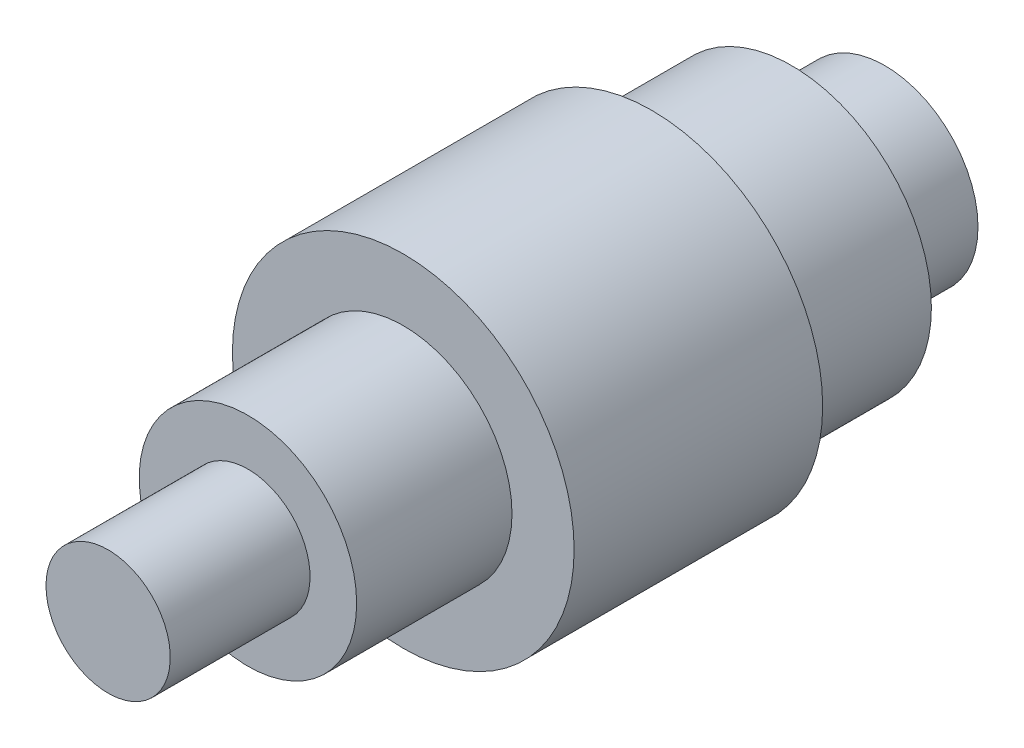
ISO-10303-21;
HEADER;
FILE_DESCRIPTION(('STEP AP214'),'2;1');
FILE_NAME('part.step','',(''),(''),'','','');
FILE_SCHEMA(('AUTOMOTIVE_DESIGN { 1 0 10303 214 1 1 1 1 }'));
ENDSEC;
DATA;
#1=APPLICATION_CONTEXT('core data for automotive mechanical design processes');
#2=APPLICATION_PROTOCOL_DEFINITION('international standard','automotive_design',2000,#1);
#3=PRODUCT_CONTEXT('',#1,'mechanical');
#4=PRODUCT('Part','Part','',(#3));
#5=PRODUCT_RELATED_PRODUCT_CATEGORY('part','',(#4));
#6=PRODUCT_DEFINITION_FORMATION('','',#4);
#7=PRODUCT_DEFINITION_CONTEXT('part definition',#1,'design');
#8=PRODUCT_DEFINITION('design','',#6,#7);
#9=PRODUCT_DEFINITION_SHAPE('','',#8);
#10=(LENGTH_UNIT() NAMED_UNIT(*) SI_UNIT(.MILLI.,.METRE.));
#11=(NAMED_UNIT(*) PLANE_ANGLE_UNIT() SI_UNIT($,.RADIAN.));
#12=(NAMED_UNIT(*) SI_UNIT($,.STERADIAN.) SOLID_ANGLE_UNIT());
#13=UNCERTAINTY_MEASURE_WITH_UNIT(LENGTH_MEASURE(1.E-05),#10,'distance_accuracy_value','');
#14=(GEOMETRIC_REPRESENTATION_CONTEXT(3) GLOBAL_UNCERTAINTY_ASSIGNED_CONTEXT((#13)) GLOBAL_UNIT_ASSIGNED_CONTEXT((#10,
#11,#12)) REPRESENTATION_CONTEXT('',''));
#15=CARTESIAN_POINT('',(0.,0.,0.));
#16=DIRECTION('',(0.,0.,1.));
#17=DIRECTION('',(1.,0.,0.));
#18=AXIS2_PLACEMENT_3D('',#15,#16,#17);
#19=CARTESIAN_POINT('',(0.,0.,30.));
#20=DIRECTION('',(0.,0.,-1.));
#21=DIRECTION('',(-1.,0.,0.));
#22=AXIS2_PLACEMENT_3D('',#19,#20,#21);
#23=CYLINDRICAL_SURFACE('',#22,30.);
#24=CARTESIAN_POINT('',(0.,0.,30.));
#25=DIRECTION('',(0.,0.,1.));
#26=DIRECTION('',(1.,0.,0.));
#27=AXIS2_PLACEMENT_3D('',#24,#25,#26);
#28=CIRCLE('',#27,30.);
#29=CARTESIAN_POINT('',(30.,0.,30.));
#30=VERTEX_POINT('',#29);
#31=EDGE_CURVE('E57',#30,#30,#28,.T.);
#32=ORIENTED_EDGE('',*,*,#31,.F.);
#33=EDGE_LOOP('',(#32));
#34=FACE_BOUND('',#33,.T.);
#35=CARTESIAN_POINT('',(0.,0.,0.));
#36=DIRECTION('',(0.,0.,1.));
#37=DIRECTION('',(1.,0.,0.));
#38=AXIS2_PLACEMENT_3D('',#35,#36,#37);
#39=CIRCLE('',#38,30.);
#40=CARTESIAN_POINT('',(30.,0.,0.));
#41=VERTEX_POINT('',#40);
#42=EDGE_CURVE('E46',#41,#41,#39,.T.);
#43=ORIENTED_EDGE('',*,*,#42,.T.);
#44=EDGE_LOOP('',(#43));
#45=FACE_BOUND('',#44,.T.);
#46=ADVANCED_FACE('F43',(#34,#45),#23,.T.);
#47=CARTESIAN_POINT('',(0.,0.,0.));
#48=DIRECTION('',(0.,0.,1.));
#49=DIRECTION('',(1.,0.,0.));
#50=AXIS2_PLACEMENT_3D('',#47,#48,#49);
#51=PLANE('',#50);
#52=ORIENTED_EDGE('',*,*,#42,.F.);
#53=EDGE_LOOP('',(#52));
#54=FACE_BOUND('',#53,.T.);
#55=ADVANCED_FACE('F90',(#54),#51,.F.);
#56=CARTESIAN_POINT('',(0.,0.,75.));
#57=DIRECTION('',(0.,0.,-1.));
#58=DIRECTION('',(-1.,0.,0.));
#59=AXIS2_PLACEMENT_3D('',#56,#57,#58);
#60=CYLINDRICAL_SURFACE('',#59,45.);
#61=CARTESIAN_POINT('',(0.,0.,75.));
#62=DIRECTION('',(0.,0.,1.));
#63=DIRECTION('',(1.,0.,0.));
#64=AXIS2_PLACEMENT_3D('',#61,#62,#63);
#65=CIRCLE('',#64,45.);
#66=CARTESIAN_POINT('',(-45.,0.,75.));
#67=VERTEX_POINT('',#66);
#68=EDGE_CURVE('E75',#67,#67,#65,.T.);
#69=CARTESIAN_POINT('',(0.,0.,30.));
#70=DIRECTION('',(0.,0.,1.));
#71=DIRECTION('',(1.,0.,0.));
#72=AXIS2_PLACEMENT_3D('',#69,#70,#71);
#73=CIRCLE('',#72,45.);
#74=CARTESIAN_POINT('',(-45.,0.,30.));
#75=VERTEX_POINT('',#74);
#76=EDGE_CURVE('E71',#75,#75,#73,.T.);
#77=CARTESIAN_POINT('',(-45.,0.,75.));
#78=CARTESIAN_POINT('',(-45.,0.,74.53125));
#79=CARTESIAN_POINT('',(-45.,0.,74.0625));
#80=CARTESIAN_POINT('',(-45.,0.,73.125));
#81=CARTESIAN_POINT('',(-45.,0.,72.65625));
#82=CARTESIAN_POINT('',(-45.,0.,71.71875));
#83=CARTESIAN_POINT('',(-45.,0.,71.25));
#84=CARTESIAN_POINT('',(-45.,0.,70.3125));
#85=CARTESIAN_POINT('',(-45.,0.,69.84375));
#86=CARTESIAN_POINT('',(-45.,0.,68.90625));
#87=CARTESIAN_POINT('',(-45.,0.,68.4375));
#88=CARTESIAN_POINT('',(-45.,0.,67.5));
#89=CARTESIAN_POINT('',(-45.,0.,67.03125));
#90=CARTESIAN_POINT('',(-45.,0.,66.09375));
#91=CARTESIAN_POINT('',(-45.,0.,65.625));
#92=CARTESIAN_POINT('',(-45.,0.,64.6875));
#93=CARTESIAN_POINT('',(-45.,0.,64.21875));
#94=CARTESIAN_POINT('',(-45.,0.,63.28125));
#95=CARTESIAN_POINT('',(-45.,0.,62.8125));
#96=CARTESIAN_POINT('',(-45.,0.,61.875));
#97=CARTESIAN_POINT('',(-45.,0.,61.40625));
#98=CARTESIAN_POINT('',(-45.,0.,60.46875));
#99=CARTESIAN_POINT('',(-45.,0.,60.));
#100=CARTESIAN_POINT('',(-45.,0.,59.0625));
#101=CARTESIAN_POINT('',(-45.,0.,58.59375));
#102=CARTESIAN_POINT('',(-45.,0.,57.65625));
#103=CARTESIAN_POINT('',(-45.,0.,57.1875));
#104=CARTESIAN_POINT('',(-45.,0.,56.25));
#105=CARTESIAN_POINT('',(-45.,0.,55.78125));
#106=CARTESIAN_POINT('',(-45.,0.,54.84375));
#107=CARTESIAN_POINT('',(-45.,0.,54.375));
#108=CARTESIAN_POINT('',(-45.,0.,53.4375));
#109=CARTESIAN_POINT('',(-45.,0.,52.96875));
#110=CARTESIAN_POINT('',(-45.,0.,52.03125));
#111=CARTESIAN_POINT('',(-45.,0.,51.5625));
#112=CARTESIAN_POINT('',(-45.,0.,50.625));
#113=CARTESIAN_POINT('',(-45.,0.,50.15625));
#114=CARTESIAN_POINT('',(-45.,0.,49.21875));
#115=CARTESIAN_POINT('',(-45.,0.,48.75));
#116=CARTESIAN_POINT('',(-45.,0.,47.8125));
#117=CARTESIAN_POINT('',(-45.,0.,47.34375));
#118=CARTESIAN_POINT('',(-45.,0.,46.40625));
#119=CARTESIAN_POINT('',(-45.,0.,45.9375));
#120=CARTESIAN_POINT('',(-45.,0.,45.));
#121=CARTESIAN_POINT('',(-45.,0.,44.53125));
#122=CARTESIAN_POINT('',(-45.,0.,43.59375));
#123=CARTESIAN_POINT('',(-45.,0.,43.125));
#124=CARTESIAN_POINT('',(-45.,0.,42.1875));
#125=CARTESIAN_POINT('',(-45.,0.,41.71875));
#126=CARTESIAN_POINT('',(-45.,0.,40.78125));
#127=CARTESIAN_POINT('',(-45.,0.,40.3125));
#128=CARTESIAN_POINT('',(-45.,0.,39.375));
#129=CARTESIAN_POINT('',(-45.,0.,38.90625));
#130=CARTESIAN_POINT('',(-45.,0.,37.96875));
#131=CARTESIAN_POINT('',(-45.,0.,37.5));
#132=CARTESIAN_POINT('',(-45.,0.,36.5625));
#133=CARTESIAN_POINT('',(-45.,0.,36.09375));
#134=CARTESIAN_POINT('',(-45.,0.,35.15625));
#135=CARTESIAN_POINT('',(-45.,0.,34.6875));
#136=CARTESIAN_POINT('',(-45.,0.,33.75));
#137=CARTESIAN_POINT('',(-45.,0.,33.28125));
#138=CARTESIAN_POINT('',(-45.,0.,32.34375));
#139=CARTESIAN_POINT('',(-45.,0.,31.875));
#140=CARTESIAN_POINT('',(-45.,0.,30.9375));
#141=CARTESIAN_POINT('',(-45.,0.,30.46875));
#142=CARTESIAN_POINT('',(-45.,0.,30.));
#143=B_SPLINE_CURVE_WITH_KNOTS('',3,(#77,#78,#79,#80,#81,#82,#83,#84,#85,#86,#87,#88,#89,#90,
#91,#92,#93,#94,#95,#96,#97,#98,#99,#100,#101,#102,#103,#104,#105,#106,#107,#108,#109,#110,#111,
#112,#113,#114,#115,#116,#117,#118,#119,#120,#121,#122,#123,#124,#125,#126,#127,#128,#129,#130,
#131,#132,#133,#134,#135,#136,#137,#138,#139,#140,#141,#142),.UNSPECIFIED.,.F.,.F.,(4,2,2,2,2,2,
2,2,2,2,2,2,2,2,2,2,2,2,2,2,2,2,2,2,2,2,2,2,2,2,2,2,4),(0.,1.40625000000001,2.81250000000001,
4.21875000000001,5.62500000000001,7.03125,8.4375,9.84375000000001,11.25,12.65625,14.0625,
15.46875,16.875,18.28125,19.6875,21.09375,22.5,23.90625,25.3125,26.71875,28.125,29.53125,
30.9375,32.34375,33.75,35.15625,36.5625,37.96875,39.375,40.78125,42.1875,43.59375,45.),.UNSPECIFIED.);
#144=EDGE_CURVE('BSEAM92',#67,#75,#143,.T.);
#145=ORIENTED_EDGE('',*,*,#68,.F.);
#146=ORIENTED_EDGE('',*,*,#76,.T.);
#147=ORIENTED_EDGE('',*,*,#144,.T.);
#148=ORIENTED_EDGE('',*,*,#144,.F.);
#149=EDGE_LOOP('',(#145,#147,#146,#148));
#150=FACE_BOUND('',#149,.T.);
#151=ADVANCED_FACE('F92',(#150),#60,.T.);
#152=CARTESIAN_POINT('',(0.,0.,30.));
#153=DIRECTION('',(0.,0.,1.));
#154=DIRECTION('',(1.,0.,0.));
#155=AXIS2_PLACEMENT_3D('',#152,#153,#154);
#156=PLANE('',#155);
#157=ORIENTED_EDGE('',*,*,#31,.T.);
#158=EDGE_LOOP('',(#157));
#159=FACE_BOUND('',#158,.T.);
#160=ORIENTED_EDGE('',*,*,#76,.F.);
#161=EDGE_LOOP('',(#160));
#162=FACE_BOUND('',#161,.T.);
#163=ADVANCED_FACE('F97',(#159,#162),#156,.F.);
#164=CARTESIAN_POINT('',(0.,0.,155.));
#165=DIRECTION('',(0.,0.,-1.));
#166=DIRECTION('',(-1.,0.,0.));
#167=AXIS2_PLACEMENT_3D('',#164,#165,#166);
#168=CYLINDRICAL_SURFACE('',#167,55.);
#169=CARTESIAN_POINT('',(0.,0.,155.));
#170=DIRECTION('',(0.,0.,1.));
#171=DIRECTION('',(1.,0.,0.));
#172=AXIS2_PLACEMENT_3D('',#169,#170,#171);
#173=CIRCLE('',#172,55.);
#174=CARTESIAN_POINT('',(55.,0.,155.));
#175=VERTEX_POINT('',#174);
#176=EDGE_CURVE('E67',#175,#175,#173,.T.);
#177=ORIENTED_EDGE('',*,*,#176,.F.);
#178=EDGE_LOOP('',(#177));
#179=FACE_BOUND('',#178,.T.);
#180=CARTESIAN_POINT('',(0.,0.,75.));
#181=DIRECTION('',(0.,0.,1.));
#182=DIRECTION('',(1.,0.,0.));
#183=AXIS2_PLACEMENT_3D('',#180,#181,#182);
#184=CIRCLE('',#183,55.);
#185=CARTESIAN_POINT('',(55.,0.,75.));
#186=VERTEX_POINT('',#185);
#187=EDGE_CURVE('E65',#186,#186,#184,.T.);
#188=ORIENTED_EDGE('',*,*,#187,.T.);
#189=EDGE_LOOP('',(#188));
#190=FACE_BOUND('',#189,.T.);
#191=ADVANCED_FACE('F104',(#179,#190),#168,.T.);
#192=CARTESIAN_POINT('',(0.,0.,155.));
#193=DIRECTION('',(0.,0.,1.));
#194=DIRECTION('',(1.,0.,0.));
#195=AXIS2_PLACEMENT_3D('',#192,#193,#194);
#196=PLANE('',#195);
#197=CARTESIAN_POINT('',(0.,0.,155.));
#198=DIRECTION('',(0.,0.,1.));
#199=DIRECTION('',(1.,0.,0.));
#200=AXIS2_PLACEMENT_3D('',#197,#198,#199);
#201=CIRCLE('',#200,35.);
#202=CARTESIAN_POINT('',(35.,0.,155.));
#203=VERTEX_POINT('',#202);
#204=EDGE_CURVE('E51',#203,#203,#201,.T.);
#205=ORIENTED_EDGE('',*,*,#204,.F.);
#206=EDGE_LOOP('',(#205));
#207=FACE_BOUND('',#206,.T.);
#208=ORIENTED_EDGE('',*,*,#176,.T.);
#209=EDGE_LOOP('',(#208));
#210=FACE_BOUND('',#209,.T.);
#211=ADVANCED_FACE('F107',(#207,#210),#196,.T.);
#212=CARTESIAN_POINT('',(0.,0.,75.));
#213=DIRECTION('',(0.,0.,1.));
#214=DIRECTION('',(1.,0.,0.));
#215=AXIS2_PLACEMENT_3D('',#212,#213,#214);
#216=PLANE('',#215);
#217=ORIENTED_EDGE('',*,*,#68,.T.);
#218=EDGE_LOOP('',(#217));
#219=FACE_BOUND('',#218,.T.);
#220=ORIENTED_EDGE('',*,*,#187,.F.);
#221=EDGE_LOOP('',(#220));
#222=FACE_BOUND('',#221,.T.);
#223=ADVANCED_FACE('F109',(#219,#222),#216,.F.);
#224=CARTESIAN_POINT('',(0.,0.,205.));
#225=DIRECTION('',(0.,0.,-1.));
#226=DIRECTION('',(-1.,0.,0.));
#227=AXIS2_PLACEMENT_3D('',#224,#225,#226);
#228=CYLINDRICAL_SURFACE('',#227,35.);
#229=CARTESIAN_POINT('',(0.,0.,205.));
#230=DIRECTION('',(0.,0.,1.));
#231=DIRECTION('',(1.,0.,0.));
#232=AXIS2_PLACEMENT_3D('',#229,#230,#231);
#233=CIRCLE('',#232,35.);
#234=CARTESIAN_POINT('',(35.,0.,205.));
#235=VERTEX_POINT('',#234);
#236=EDGE_CURVE('E62',#235,#235,#233,.T.);
#237=ORIENTED_EDGE('',*,*,#236,.F.);
#238=EDGE_LOOP('',(#237));
#239=FACE_BOUND('',#238,.T.);
#240=ORIENTED_EDGE('',*,*,#204,.T.);
#241=EDGE_LOOP('',(#240));
#242=FACE_BOUND('',#241,.T.);
#243=ADVANCED_FACE('F112',(#239,#242),#228,.T.);
#244=CARTESIAN_POINT('',(0.,0.,205.));
#245=DIRECTION('',(0.,0.,1.));
#246=DIRECTION('',(1.,0.,0.));
#247=AXIS2_PLACEMENT_3D('',#244,#245,#246);
#248=PLANE('',#247);
#249=CARTESIAN_POINT('',(0.,0.,205.));
#250=DIRECTION('',(0.,0.,1.));
#251=DIRECTION('',(1.,0.,0.));
#252=AXIS2_PLACEMENT_3D('',#249,#250,#251);
#253=CIRCLE('',#252,20.);
#254=CARTESIAN_POINT('',(-20.,0.,205.));
#255=VERTEX_POINT('',#254);
#256=EDGE_CURVE('E10',#255,#255,#253,.T.);
#257=ORIENTED_EDGE('',*,*,#256,.F.);
#258=EDGE_LOOP('',(#257));
#259=FACE_BOUND('',#258,.T.);
#260=ORIENTED_EDGE('',*,*,#236,.T.);
#261=EDGE_LOOP('',(#260));
#262=FACE_BOUND('',#261,.T.);
#263=ADVANCED_FACE('F119',(#259,#262),#248,.T.);
#264=CARTESIAN_POINT('',(0.,0.,250.));
#265=DIRECTION('',(0.,0.,-1.));
#266=DIRECTION('',(-1.,0.,0.));
#267=AXIS2_PLACEMENT_3D('',#264,#265,#266);
#268=CYLINDRICAL_SURFACE('',#267,20.);
#269=CARTESIAN_POINT('',(0.,0.,250.));
#270=DIRECTION('',(0.,0.,1.));
#271=DIRECTION('',(1.,0.,0.));
#272=AXIS2_PLACEMENT_3D('',#269,#270,#271);
#273=CIRCLE('',#272,20.);
#274=CARTESIAN_POINT('',(-20.,0.,250.));
#275=VERTEX_POINT('',#274);
#276=EDGE_CURVE('E61',#275,#275,#273,.T.);
#277=CARTESIAN_POINT('',(-20.,0.,250.));
#278=CARTESIAN_POINT('',(-20.,0.,249.53125));
#279=CARTESIAN_POINT('',(-20.,0.,249.0625));
#280=CARTESIAN_POINT('',(-20.,0.,248.125));
#281=CARTESIAN_POINT('',(-20.,0.,247.65625));
#282=CARTESIAN_POINT('',(-20.,0.,246.71875));
#283=CARTESIAN_POINT('',(-20.,0.,246.25));
#284=CARTESIAN_POINT('',(-20.,0.,245.3125));
#285=CARTESIAN_POINT('',(-20.,0.,244.84375));
#286=CARTESIAN_POINT('',(-20.,0.,243.90625));
#287=CARTESIAN_POINT('',(-20.,0.,243.4375));
#288=CARTESIAN_POINT('',(-20.,0.,242.5));
#289=CARTESIAN_POINT('',(-20.,0.,242.03125));
#290=CARTESIAN_POINT('',(-20.,0.,241.09375));
#291=CARTESIAN_POINT('',(-20.,0.,240.625));
#292=CARTESIAN_POINT('',(-20.,0.,239.6875));
#293=CARTESIAN_POINT('',(-20.,0.,239.21875));
#294=CARTESIAN_POINT('',(-20.,0.,238.28125));
#295=CARTESIAN_POINT('',(-20.,0.,237.8125));
#296=CARTESIAN_POINT('',(-20.,0.,236.875));
#297=CARTESIAN_POINT('',(-20.,0.,236.40625));
#298=CARTESIAN_POINT('',(-20.,0.,235.46875));
#299=CARTESIAN_POINT('',(-20.,0.,235.));
#300=CARTESIAN_POINT('',(-20.,0.,234.0625));
#301=CARTESIAN_POINT('',(-20.,0.,233.59375));
#302=CARTESIAN_POINT('',(-20.,0.,232.65625));
#303=CARTESIAN_POINT('',(-20.,0.,232.1875));
#304=CARTESIAN_POINT('',(-20.,0.,231.25));
#305=CARTESIAN_POINT('',(-20.,0.,230.78125));
#306=CARTESIAN_POINT('',(-20.,0.,229.84375));
#307=CARTESIAN_POINT('',(-20.,0.,229.375));
#308=CARTESIAN_POINT('',(-20.,0.,228.4375));
#309=CARTESIAN_POINT('',(-20.,0.,227.96875));
#310=CARTESIAN_POINT('',(-20.,0.,227.03125));
#311=CARTESIAN_POINT('',(-20.,0.,226.5625));
#312=CARTESIAN_POINT('',(-20.,0.,225.625));
#313=CARTESIAN_POINT('',(-20.,0.,225.15625));
#314=CARTESIAN_POINT('',(-20.,0.,224.21875));
#315=CARTESIAN_POINT('',(-20.,0.,223.75));
#316=CARTESIAN_POINT('',(-20.,0.,222.8125));
#317=CARTESIAN_POINT('',(-20.,0.,222.34375));
#318=CARTESIAN_POINT('',(-20.,0.,221.40625));
#319=CARTESIAN_POINT('',(-20.,0.,220.9375));
#320=CARTESIAN_POINT('',(-20.,0.,220.));
#321=CARTESIAN_POINT('',(-20.,0.,219.53125));
#322=CARTESIAN_POINT('',(-20.,0.,218.59375));
#323=CARTESIAN_POINT('',(-20.,0.,218.125));
#324=CARTESIAN_POINT('',(-20.,0.,217.1875));
#325=CARTESIAN_POINT('',(-20.,0.,216.71875));
#326=CARTESIAN_POINT('',(-20.,0.,215.78125));
#327=CARTESIAN_POINT('',(-20.,0.,215.3125));
#328=CARTESIAN_POINT('',(-20.,0.,214.375));
#329=CARTESIAN_POINT('',(-20.,0.,213.90625));
#330=CARTESIAN_POINT('',(-20.,0.,212.96875));
#331=CARTESIAN_POINT('',(-20.,0.,212.5));
#332=CARTESIAN_POINT('',(-20.,0.,211.5625));
#333=CARTESIAN_POINT('',(-20.,0.,211.09375));
#334=CARTESIAN_POINT('',(-20.,0.,210.15625));
#335=CARTESIAN_POINT('',(-20.,0.,209.6875));
#336=CARTESIAN_POINT('',(-20.,0.,208.75));
#337=CARTESIAN_POINT('',(-20.,0.,208.28125));
#338=CARTESIAN_POINT('',(-20.,0.,207.34375));
#339=CARTESIAN_POINT('',(-20.,0.,206.875));
#340=CARTESIAN_POINT('',(-20.,0.,205.9375));
#341=CARTESIAN_POINT('',(-20.,0.,205.46875));
#342=CARTESIAN_POINT('',(-20.,0.,205.));
#343=B_SPLINE_CURVE_WITH_KNOTS('',3,(#277,#278,#279,#280,#281,#282,#283,#284,#285,#286,#287,
#288,#289,#290,#291,#292,#293,#294,#295,#296,#297,#298,#299,#300,#301,#302,#303,#304,#305,#306,
#307,#308,#309,#310,#311,#312,#313,#314,#315,#316,#317,#318,#319,#320,#321,#322,#323,#324,#325,
#326,#327,#328,#329,#330,#331,#332,#333,#334,#335,#336,#337,#338,#339,#340,#341,#342),
.UNSPECIFIED.,.F.,.F.,(4,2,2,2,2,2,2,2,2,2,2,2,2,2,2,2,2,2,2,2,2,2,2,2,2,2,2,2,2,2,2,2,4),(0.,
1.40625000000003,2.81250000000002,4.21875000000002,5.62500000000002,7.03125000000002,
8.43750000000001,9.84375000000001,11.25,12.65625,14.0625,15.46875,16.875,18.28125,19.6875,
21.09375,22.5,23.90625,25.3125,26.71875,28.125,29.53125,30.9375,32.34375,33.75,35.15625,36.5625,
37.96875,39.375,40.78125,42.1875,43.59375,45.),.UNSPECIFIED.);
#344=EDGE_CURVE('BSEAM123',#275,#255,#343,.T.);
#345=ORIENTED_EDGE('',*,*,#276,.F.);
#346=ORIENTED_EDGE('',*,*,#256,.T.);
#347=ORIENTED_EDGE('',*,*,#344,.T.);
#348=ORIENTED_EDGE('',*,*,#344,.F.);
#349=EDGE_LOOP('',(#345,#347,#346,#348));
#350=FACE_BOUND('',#349,.T.);
#351=ADVANCED_FACE('F123',(#350),#268,.T.);
#352=CARTESIAN_POINT('',(0.,0.,250.));
#353=DIRECTION('',(0.,0.,1.));
#354=DIRECTION('',(1.,0.,0.));
#355=AXIS2_PLACEMENT_3D('',#352,#353,#354);
#356=PLANE('',#355);
#357=ORIENTED_EDGE('',*,*,#276,.T.);
#358=EDGE_LOOP('',(#357));
#359=FACE_BOUND('',#358,.T.);
#360=ADVANCED_FACE('F127',(#359),#356,.T.);
#361=CLOSED_SHELL('',(#46,#55,#151,#163,#191,#211,#223,#243,#263,#351,#360));
#362=MANIFOLD_SOLID_BREP('B2',#361);
#363=ADVANCED_BREP_SHAPE_REPRESENTATION('',(#18,#362),#14);
#364=SHAPE_DEFINITION_REPRESENTATION(#9,#363);
ENDSEC;
END-ISO-10303-21;
